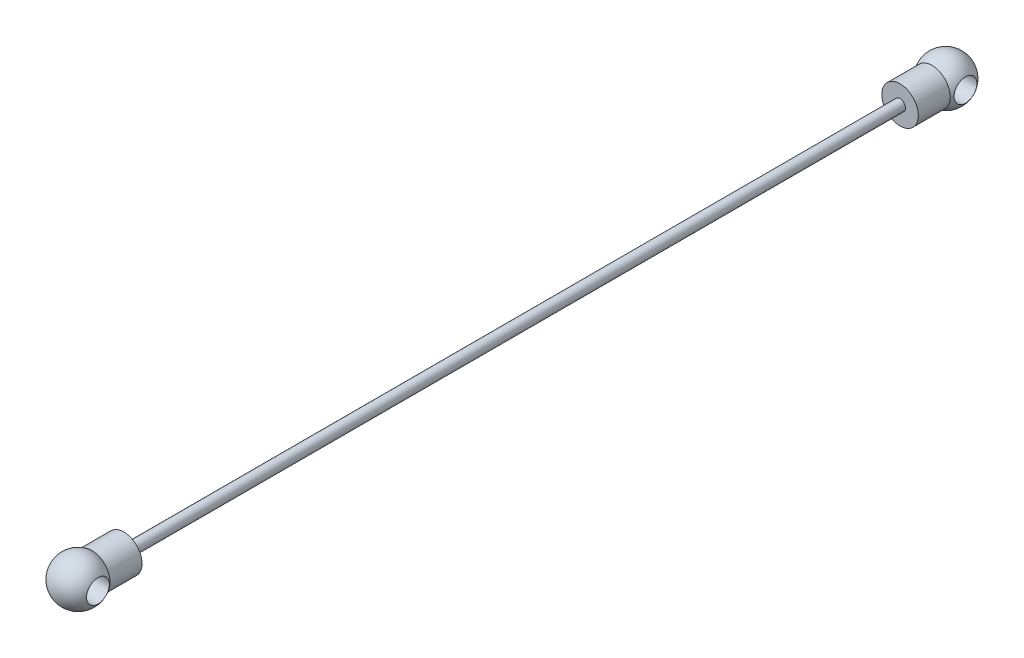
ISO-10303-21;
HEADER;
FILE_DESCRIPTION(('STEP AP214'),'2;1');
FILE_NAME('part.step','',(''),(''),'','','');
FILE_SCHEMA(('AUTOMOTIVE_DESIGN { 1 0 10303 214 1 1 1 1 }'));
ENDSEC;
DATA;
#1=APPLICATION_CONTEXT('core data for automotive mechanical design processes');
#2=APPLICATION_PROTOCOL_DEFINITION('international standard','automotive_design',2000,#1);
#3=PRODUCT_CONTEXT('',#1,'mechanical');
#4=PRODUCT('Part','Part','',(#3));
#5=PRODUCT_RELATED_PRODUCT_CATEGORY('part','',(#4));
#6=PRODUCT_DEFINITION_FORMATION('','',#4);
#7=PRODUCT_DEFINITION_CONTEXT('part definition',#1,'design');
#8=PRODUCT_DEFINITION('design','',#6,#7);
#9=PRODUCT_DEFINITION_SHAPE('','',#8);
#10=(LENGTH_UNIT() NAMED_UNIT(*) SI_UNIT(.MILLI.,.METRE.));
#11=(NAMED_UNIT(*) PLANE_ANGLE_UNIT() SI_UNIT($,.RADIAN.));
#12=(NAMED_UNIT(*) SI_UNIT($,.STERADIAN.) SOLID_ANGLE_UNIT());
#13=UNCERTAINTY_MEASURE_WITH_UNIT(LENGTH_MEASURE(1.E-05),#10,'distance_accuracy_value','');
#14=(GEOMETRIC_REPRESENTATION_CONTEXT(3) GLOBAL_UNCERTAINTY_ASSIGNED_CONTEXT((#13)) GLOBAL_UNIT_ASSIGNED_CONTEXT((#10,
#11,#12)) REPRESENTATION_CONTEXT('',''));
#15=CARTESIAN_POINT('',(0.,0.,0.));
#16=DIRECTION('',(0.,0.,1.));
#17=DIRECTION('',(1.,0.,0.));
#18=AXIS2_PLACEMENT_3D('',#15,#16,#17);
#19=CARTESIAN_POINT('',(0.,0.,-47.5));
#20=DIRECTION('',(0.,0.,1.));
#21=DIRECTION('',(1.,0.,0.));
#22=AXIS2_PLACEMENT_3D('',#19,#20,#21);
#23=SPHERICAL_SURFACE('',#22,2.5);
#24=CARTESIAN_POINT('',(0.,0.,-46.));
#25=DIRECTION('',(0.,0.,-0.999999999999998));
#26=DIRECTION('',(-1.,0.,0.));
#27=AXIS2_PLACEMENT_3D('',#24,#25,#26);
#28=CIRCLE('',#27,2.);
#29=CARTESIAN_POINT('',(-2.,0.,-46.));
#30=VERTEX_POINT('',#29);
#31=EDGE_CURVE('E61',#30,#30,#28,.F.);
#32=ORIENTED_EDGE('',*,*,#31,.F.);
#33=EDGE_LOOP('',(#32));
#34=FACE_BOUND('',#33,.T.);
#35=CARTESIAN_POINT('',(-2.1650635094611,0.,-47.5));
#36=DIRECTION('',(1.,0.,0.));
#37=DIRECTION('',(0.,0.,-1.));
#38=AXIS2_PLACEMENT_3D('',#35,#36,#37);
#39=CIRCLE('',#38,1.25);
#40=CARTESIAN_POINT('',(-2.1650635094611,0.,-48.75));
#41=VERTEX_POINT('',#40);
#42=EDGE_CURVE('E63',#41,#41,#39,.F.);
#43=ORIENTED_EDGE('',*,*,#42,.F.);
#44=EDGE_LOOP('',(#43));
#45=FACE_BOUND('',#44,.T.);
#46=CARTESIAN_POINT('',(2.1650635094611,0.,-47.5));
#47=DIRECTION('',(-1.,0.,0.));
#48=DIRECTION('',(0.,0.,1.));
#49=AXIS2_PLACEMENT_3D('',#46,#47,#48);
#50=CIRCLE('',#49,1.25);
#51=CARTESIAN_POINT('',(2.1650635094611,0.,-46.25));
#52=VERTEX_POINT('',#51);
#53=EDGE_CURVE('E41',#52,#52,#50,.F.);
#54=ORIENTED_EDGE('',*,*,#53,.F.);
#55=EDGE_LOOP('',(#54));
#56=FACE_BOUND('',#55,.T.);
#57=ADVANCED_FACE('F40',(#34,#45,#56),#23,.T.);
#58=CARTESIAN_POINT('',(0.,0.,-47.5));
#59=DIRECTION('',(0.,0.,1.));
#60=DIRECTION('',(1.,0.,0.));
#61=AXIS2_PLACEMENT_3D('',#58,#59,#60);
#62=CYLINDRICAL_SURFACE('',#61,2.);
#63=CARTESIAN_POINT('',(0.,0.,-42.5));
#64=DIRECTION('',(0.,0.,1.));
#65=DIRECTION('',(1.,0.,0.));
#66=AXIS2_PLACEMENT_3D('',#63,#64,#65);
#67=CIRCLE('',#66,2.);
#68=CARTESIAN_POINT('',(2.,0.,-42.5));
#69=VERTEX_POINT('',#68);
#70=EDGE_CURVE('E64',#69,#69,#67,.T.);
#71=ORIENTED_EDGE('',*,*,#70,.F.);
#72=EDGE_LOOP('',(#71));
#73=FACE_BOUND('',#72,.T.);
#74=ORIENTED_EDGE('',*,*,#31,.T.);
#75=EDGE_LOOP('',(#74));
#76=FACE_BOUND('',#75,.T.);
#77=ADVANCED_FACE('F74',(#73,#76),#62,.T.);
#78=CARTESIAN_POINT('',(0.,0.,47.5));
#79=DIRECTION('',(0.,0.,-1.));
#80=DIRECTION('',(-1.,0.,0.));
#81=AXIS2_PLACEMENT_3D('',#78,#79,#80);
#82=CYLINDRICAL_SURFACE('',#81,2.);
#83=CARTESIAN_POINT('',(0.,0.,42.5));
#84=DIRECTION('',(0.,0.,1.));
#85=DIRECTION('',(1.,0.,0.));
#86=AXIS2_PLACEMENT_3D('',#83,#84,#85);
#87=CIRCLE('',#86,2.);
#88=CARTESIAN_POINT('',(2.,0.,42.5));
#89=VERTEX_POINT('',#88);
#90=EDGE_CURVE('E49',#89,#89,#87,.T.);
#91=ORIENTED_EDGE('',*,*,#90,.T.);
#92=EDGE_LOOP('',(#91));
#93=FACE_BOUND('',#92,.T.);
#94=CARTESIAN_POINT('',(0.,0.,46.));
#95=DIRECTION('',(0.,0.,0.999999999999998));
#96=DIRECTION('',(1.,0.,0.));
#97=AXIS2_PLACEMENT_3D('',#94,#95,#96);
#98=CIRCLE('',#97,2.);
#99=CARTESIAN_POINT('',(2.,0.,46.));
#100=VERTEX_POINT('',#99);
#101=EDGE_CURVE('E10',#100,#100,#98,.T.);
#102=ORIENTED_EDGE('',*,*,#101,.F.);
#103=EDGE_LOOP('',(#102));
#104=FACE_BOUND('',#103,.T.);
#105=ADVANCED_FACE('F81',(#93,#104),#82,.T.);
#106=CARTESIAN_POINT('',(0.,0.,42.5));
#107=DIRECTION('',(0.,0.,-1.));
#108=DIRECTION('',(-1.,0.,0.));
#109=AXIS2_PLACEMENT_3D('',#106,#107,#108);
#110=CYLINDRICAL_SURFACE('',#109,0.6);
#111=CARTESIAN_POINT('',(0.,0.,42.5));
#112=DIRECTION('',(0.,0.,1.));
#113=DIRECTION('',(1.,0.,0.));
#114=AXIS2_PLACEMENT_3D('',#111,#112,#113);
#115=CIRCLE('',#114,0.6);
#116=CARTESIAN_POINT('',(0.6,0.,42.5));
#117=VERTEX_POINT('',#116);
#118=EDGE_CURVE('E44',#117,#117,#115,.T.);
#119=ORIENTED_EDGE('',*,*,#118,.F.);
#120=EDGE_LOOP('',(#119));
#121=FACE_BOUND('',#120,.T.);
#122=CARTESIAN_POINT('',(0.,0.,-42.5));
#123=DIRECTION('',(0.,0.,1.));
#124=DIRECTION('',(1.,0.,0.));
#125=AXIS2_PLACEMENT_3D('',#122,#123,#124);
#126=CIRCLE('',#125,0.6);
#127=CARTESIAN_POINT('',(0.6,0.,-42.5));
#128=VERTEX_POINT('',#127);
#129=EDGE_CURVE('E53',#128,#128,#126,.T.);
#130=ORIENTED_EDGE('',*,*,#129,.T.);
#131=EDGE_LOOP('',(#130));
#132=FACE_BOUND('',#131,.T.);
#133=ADVANCED_FACE('F39',(#121,#132),#110,.T.);
#134=CARTESIAN_POINT('',(0.,0.,42.5));
#135=DIRECTION('',(0.,0.,1.));
#136=DIRECTION('',(1.,0.,0.));
#137=AXIS2_PLACEMENT_3D('',#134,#135,#136);
#138=PLANE('',#137);
#139=ORIENTED_EDGE('',*,*,#118,.T.);
#140=EDGE_LOOP('',(#139));
#141=FACE_BOUND('',#140,.T.);
#142=ORIENTED_EDGE('',*,*,#90,.F.);
#143=EDGE_LOOP('',(#142));
#144=FACE_BOUND('',#143,.T.);
#145=ADVANCED_FACE('F96',(#141,#144),#138,.F.);
#146=CARTESIAN_POINT('',(0.,0.,47.5));
#147=DIRECTION('',(0.,0.,-1.));
#148=DIRECTION('',(1.,0.,0.));
#149=AXIS2_PLACEMENT_3D('',#146,#147,#148);
#150=SPHERICAL_SURFACE('',#149,2.5);
#151=CARTESIAN_POINT('',(2.1650635094611,0.,47.5));
#152=DIRECTION('',(-1.,0.,0.));
#153=DIRECTION('',(0.,0.,1.));
#154=AXIS2_PLACEMENT_3D('',#151,#152,#153);
#155=CIRCLE('',#154,1.25);
#156=CARTESIAN_POINT('',(2.1650635094611,0.,48.75));
#157=VERTEX_POINT('',#156);
#158=EDGE_CURVE('E59',#157,#157,#155,.T.);
#159=ORIENTED_EDGE('',*,*,#158,.T.);
#160=EDGE_LOOP('',(#159));
#161=FACE_BOUND('',#160,.T.);
#162=CARTESIAN_POINT('',(-2.1650635094611,0.,47.5));
#163=DIRECTION('',(1.,0.,0.));
#164=DIRECTION('',(0.,0.,-1.));
#165=AXIS2_PLACEMENT_3D('',#162,#163,#164);
#166=CIRCLE('',#165,1.25);
#167=CARTESIAN_POINT('',(-2.1650635094611,0.,46.25));
#168=VERTEX_POINT('',#167);
#169=EDGE_CURVE('E54',#168,#168,#166,.T.);
#170=ORIENTED_EDGE('',*,*,#169,.T.);
#171=EDGE_LOOP('',(#170));
#172=FACE_BOUND('',#171,.T.);
#173=ORIENTED_EDGE('',*,*,#101,.T.);
#174=EDGE_LOOP('',(#173));
#175=FACE_BOUND('',#174,.T.);
#176=ADVANCED_FACE('F94',(#161,#172,#175),#150,.T.);
#177=CARTESIAN_POINT('',(-2.5,0.,47.5));
#178=DIRECTION('',(1.,0.,0.));
#179=DIRECTION('',(0.,0.,-1.));
#180=AXIS2_PLACEMENT_3D('',#177,#178,#179);
#181=CYLINDRICAL_SURFACE('',#180,1.25);
#182=ORIENTED_EDGE('',*,*,#169,.F.);
#183=EDGE_LOOP('',(#182));
#184=FACE_BOUND('',#183,.T.);
#185=ORIENTED_EDGE('',*,*,#158,.F.);
#186=EDGE_LOOP('',(#185));
#187=FACE_BOUND('',#186,.T.);
#188=ADVANCED_FACE('F87',(#184,#187),#181,.F.);
#189=CARTESIAN_POINT('',(0.,0.,-42.5));
#190=DIRECTION('',(0.,0.,-1.));
#191=DIRECTION('',(1.,0.,0.));
#192=AXIS2_PLACEMENT_3D('',#189,#190,#191);
#193=PLANE('',#192);
#194=ORIENTED_EDGE('',*,*,#129,.F.);
#195=EDGE_LOOP('',(#194));
#196=FACE_BOUND('',#195,.T.);
#197=ORIENTED_EDGE('',*,*,#70,.T.);
#198=EDGE_LOOP('',(#197));
#199=FACE_BOUND('',#198,.T.);
#200=ADVANCED_FACE('F90',(#196,#199),#193,.F.);
#201=CARTESIAN_POINT('',(-2.5,0.,-47.5));
#202=DIRECTION('',(1.,0.,0.));
#203=DIRECTION('',(0.,0.,-1.));
#204=AXIS2_PLACEMENT_3D('',#201,#202,#203);
#205=CYLINDRICAL_SURFACE('',#204,1.25);
#206=ORIENTED_EDGE('',*,*,#42,.T.);
#207=EDGE_LOOP('',(#206));
#208=FACE_BOUND('',#207,.T.);
#209=ORIENTED_EDGE('',*,*,#53,.T.);
#210=EDGE_LOOP('',(#209));
#211=FACE_BOUND('',#210,.T.);
#212=ADVANCED_FACE('F72',(#208,#211),#205,.F.);
#213=CLOSED_SHELL('',(#57,#77,#105,#133,#145,#176,#188,#200,#212));
#214=MANIFOLD_SOLID_BREP('B2',#213);
#215=ADVANCED_BREP_SHAPE_REPRESENTATION('',(#18,#214),#14);
#216=SHAPE_DEFINITION_REPRESENTATION(#9,#215);
ENDSEC;
END-ISO-10303-21;
